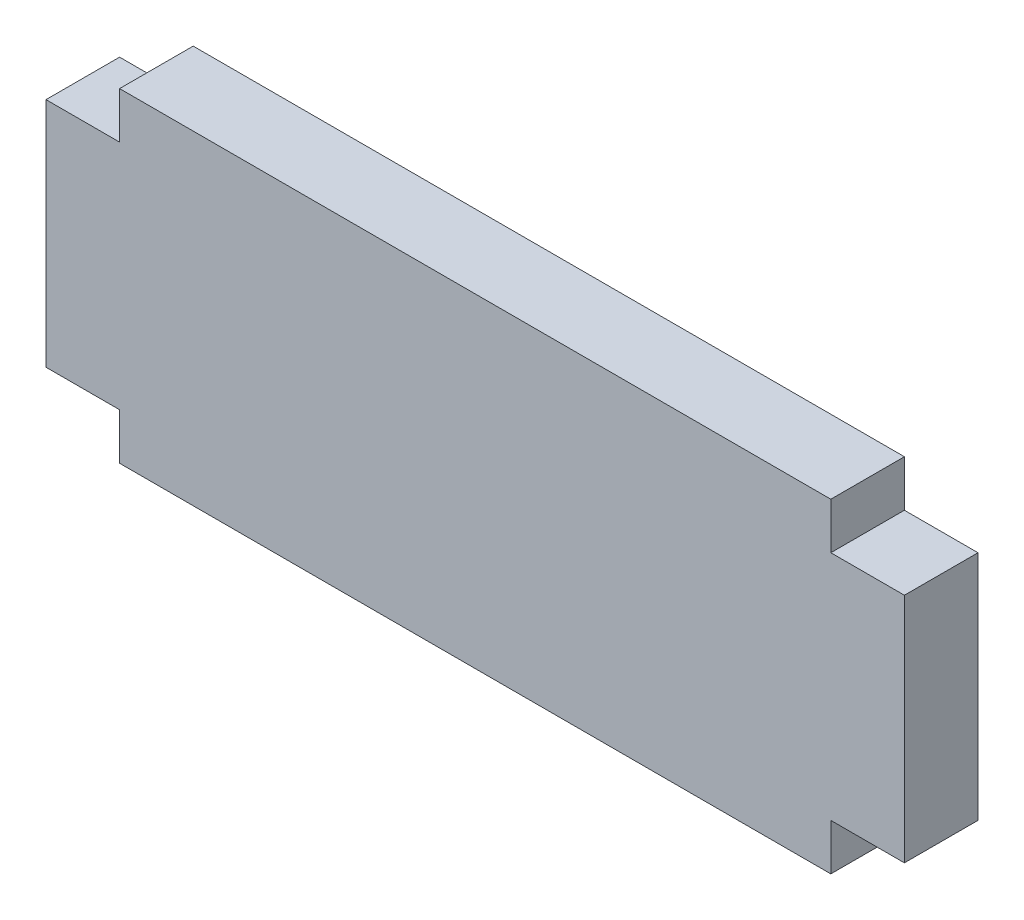
ISO-10303-21;
HEADER;
FILE_DESCRIPTION(('STEP AP214'),'2;1');
FILE_NAME('part.step','',(''),(''),'','','');
FILE_SCHEMA(('AUTOMOTIVE_DESIGN { 1 0 10303 214 1 1 1 1 }'));
ENDSEC;
DATA;
#1=APPLICATION_CONTEXT('core data for automotive mechanical design processes');
#2=APPLICATION_PROTOCOL_DEFINITION('international standard','automotive_design',2000,#1);
#3=PRODUCT_CONTEXT('',#1,'mechanical');
#4=PRODUCT('Part','Part','',(#3));
#5=PRODUCT_RELATED_PRODUCT_CATEGORY('part','',(#4));
#6=PRODUCT_DEFINITION_FORMATION('','',#4);
#7=PRODUCT_DEFINITION_CONTEXT('part definition',#1,'design');
#8=PRODUCT_DEFINITION('design','',#6,#7);
#9=PRODUCT_DEFINITION_SHAPE('','',#8);
#10=(LENGTH_UNIT() NAMED_UNIT(*) SI_UNIT(.MILLI.,.METRE.));
#11=(NAMED_UNIT(*) PLANE_ANGLE_UNIT() SI_UNIT($,.RADIAN.));
#12=(NAMED_UNIT(*) SI_UNIT($,.STERADIAN.) SOLID_ANGLE_UNIT());
#13=UNCERTAINTY_MEASURE_WITH_UNIT(LENGTH_MEASURE(1.E-05),#10,'distance_accuracy_value','');
#14=(GEOMETRIC_REPRESENTATION_CONTEXT(3) GLOBAL_UNCERTAINTY_ASSIGNED_CONTEXT((#13)) GLOBAL_UNIT_ASSIGNED_CONTEXT((#10,
#11,#12)) REPRESENTATION_CONTEXT('',''));
#15=CARTESIAN_POINT('',(0.,0.,0.));
#16=DIRECTION('',(0.,0.,1.));
#17=DIRECTION('',(1.,0.,0.));
#18=AXIS2_PLACEMENT_3D('',#15,#16,#17);
#19=CARTESIAN_POINT('',(0.,5.,3.175));
#20=DIRECTION('',(0.,-1.,0.));
#21=DIRECTION('',(1.,0.,0.));
#22=AXIS2_PLACEMENT_3D('',#19,#20,#21);
#23=PLANE('',#22);
#24=DIRECTION('',(-1.,0.,0.));
#25=VECTOR('',#24,1.);
#26=CARTESIAN_POINT('',(0.,5.,0.));
#27=LINE('',#26,#25);
#28=CARTESIAN_POINT('',(-15.3423,5.,0.));
#29=VERTEX_POINT('',#28);
#30=CARTESIAN_POINT('',(-18.5173,5.,0.));
#31=VERTEX_POINT('',#30);
#32=EDGE_CURVE('E163',#29,#31,#27,.T.);
#33=ORIENTED_EDGE('',*,*,#32,.T.);
#34=DIRECTION('',(0.,0.,-1.));
#35=VECTOR('',#34,1.);
#36=CARTESIAN_POINT('',(-18.5173,5.,3.175));
#37=LINE('',#36,#35);
#38=CARTESIAN_POINT('',(-18.5173,5.,3.175));
#39=VERTEX_POINT('',#38);
#40=EDGE_CURVE('E11',#39,#31,#37,.T.);
#41=ORIENTED_EDGE('',*,*,#40,.F.);
#42=DIRECTION('',(-1.,0.,0.));
#43=VECTOR('',#42,1.);
#44=CARTESIAN_POINT('',(0.,5.,3.175));
#45=LINE('',#44,#43);
#46=CARTESIAN_POINT('',(-15.3423,5.,3.175));
#47=VERTEX_POINT('',#46);
#48=EDGE_CURVE('E226',#47,#39,#45,.T.);
#49=ORIENTED_EDGE('',*,*,#48,.F.);
#50=DIRECTION('',(0.,0.,-1.));
#51=VECTOR('',#50,1.);
#52=CARTESIAN_POINT('',(-15.3423,5.,3.175));
#53=LINE('',#52,#51);
#54=EDGE_CURVE('E55',#47,#29,#53,.T.);
#55=ORIENTED_EDGE('',*,*,#54,.T.);
#56=EDGE_LOOP('',(#33,#41,#49,#55));
#57=FACE_BOUND('',#56,.T.);
#58=ADVANCED_FACE('F39',(#57),#23,.F.);
#59=CARTESIAN_POINT('',(-18.5173,0.,3.175));
#60=DIRECTION('',(1.,0.,0.));
#61=DIRECTION('',(0.,1.,0.));
#62=AXIS2_PLACEMENT_3D('',#59,#60,#61);
#63=PLANE('',#62);
#64=DIRECTION('',(0.,-1.,0.));
#65=VECTOR('',#64,1.);
#66=CARTESIAN_POINT('',(-18.5173,0.,0.));
#67=LINE('',#66,#65);
#68=CARTESIAN_POINT('',(-18.5173,-5.,0.));
#69=VERTEX_POINT('',#68);
#70=EDGE_CURVE('E165',#31,#69,#67,.T.);
#71=ORIENTED_EDGE('',*,*,#70,.T.);
#72=DIRECTION('',(0.,0.,-1.));
#73=VECTOR('',#72,1.);
#74=CARTESIAN_POINT('',(-18.5173,-5.,3.175));
#75=LINE('',#74,#73);
#76=CARTESIAN_POINT('',(-18.5173,-5.,3.175));
#77=VERTEX_POINT('',#76);
#78=EDGE_CURVE('E47',#77,#69,#75,.T.);
#79=ORIENTED_EDGE('',*,*,#78,.F.);
#80=DIRECTION('',(0.,-1.,0.));
#81=VECTOR('',#80,1.);
#82=CARTESIAN_POINT('',(-18.5173,0.,3.175));
#83=LINE('',#82,#81);
#84=EDGE_CURVE('E105',#39,#77,#83,.T.);
#85=ORIENTED_EDGE('',*,*,#84,.F.);
#86=ORIENTED_EDGE('',*,*,#40,.T.);
#87=EDGE_LOOP('',(#71,#79,#85,#86));
#88=FACE_BOUND('',#87,.T.);
#89=ADVANCED_FACE('F212',(#88),#63,.F.);
#90=CARTESIAN_POINT('',(0.,-5.,3.175));
#91=DIRECTION('',(0.,-1.,0.));
#92=DIRECTION('',(1.,0.,0.));
#93=AXIS2_PLACEMENT_3D('',#90,#91,#92);
#94=PLANE('',#93);
#95=DIRECTION('',(-1.,0.,0.));
#96=VECTOR('',#95,1.);
#97=CARTESIAN_POINT('',(0.,-5.,0.));
#98=LINE('',#97,#96);
#99=CARTESIAN_POINT('',(-15.3423,-5.,0.));
#100=VERTEX_POINT('',#99);
#101=EDGE_CURVE('E168',#100,#69,#98,.T.);
#102=ORIENTED_EDGE('',*,*,#101,.F.);
#103=DIRECTION('',(0.,0.,-1.));
#104=VECTOR('',#103,1.);
#105=CARTESIAN_POINT('',(-15.3423,-5.,3.175));
#106=LINE('',#105,#104);
#107=CARTESIAN_POINT('',(-15.3423,-5.,3.175));
#108=VERTEX_POINT('',#107);
#109=EDGE_CURVE('E205',#108,#100,#106,.T.);
#110=ORIENTED_EDGE('',*,*,#109,.F.);
#111=DIRECTION('',(-1.,0.,0.));
#112=VECTOR('',#111,1.);
#113=CARTESIAN_POINT('',(0.,-5.,3.175));
#114=LINE('',#113,#112);
#115=EDGE_CURVE('E211',#108,#77,#114,.T.);
#116=ORIENTED_EDGE('',*,*,#115,.T.);
#117=ORIENTED_EDGE('',*,*,#78,.T.);
#118=EDGE_LOOP('',(#102,#110,#116,#117));
#119=FACE_BOUND('',#118,.T.);
#120=ADVANCED_FACE('F209',(#119),#94,.T.);
#121=CARTESIAN_POINT('',(-15.3423,0.,3.175));
#122=DIRECTION('',(-1.,0.,0.));
#123=DIRECTION('',(0.,0.,1.));
#124=AXIS2_PLACEMENT_3D('',#121,#122,#123);
#125=PLANE('',#124);
#126=DIRECTION('',(0.,1.,0.));
#127=VECTOR('',#126,1.);
#128=CARTESIAN_POINT('',(-15.3423,0.,0.));
#129=LINE('',#128,#127);
#130=CARTESIAN_POINT('',(-15.3423,-7.,0.));
#131=VERTEX_POINT('',#130);
#132=EDGE_CURVE('E171',#131,#100,#129,.T.);
#133=ORIENTED_EDGE('',*,*,#132,.F.);
#134=DIRECTION('',(0.,0.,-1.));
#135=VECTOR('',#134,1.);
#136=CARTESIAN_POINT('',(-15.3423,-7.,3.175));
#137=LINE('',#136,#135);
#138=CARTESIAN_POINT('',(-15.3423,-7.,3.175));
#139=VERTEX_POINT('',#138);
#140=EDGE_CURVE('E203',#139,#131,#137,.T.);
#141=ORIENTED_EDGE('',*,*,#140,.F.);
#142=DIRECTION('',(0.,1.,0.));
#143=VECTOR('',#142,1.);
#144=CARTESIAN_POINT('',(-15.3423,0.,3.175));
#145=LINE('',#144,#143);
#146=EDGE_CURVE('E159',#139,#108,#145,.T.);
#147=ORIENTED_EDGE('',*,*,#146,.T.);
#148=ORIENTED_EDGE('',*,*,#109,.T.);
#149=EDGE_LOOP('',(#133,#141,#147,#148));
#150=FACE_BOUND('',#149,.T.);
#151=ADVANCED_FACE('F220',(#150),#125,.T.);
#152=CARTESIAN_POINT('',(0.,-7.,3.175));
#153=DIRECTION('',(0.,1.,0.));
#154=DIRECTION('',(0.,0.,1.));
#155=AXIS2_PLACEMENT_3D('',#152,#153,#154);
#156=PLANE('',#155);
#157=DIRECTION('',(1.,0.,0.));
#158=VECTOR('',#157,1.);
#159=CARTESIAN_POINT('',(0.,-7.,0.));
#160=LINE('',#159,#158);
#161=CARTESIAN_POINT('',(15.3423,-7.,0.));
#162=VERTEX_POINT('',#161);
#163=EDGE_CURVE('E174',#131,#162,#160,.T.);
#164=ORIENTED_EDGE('',*,*,#163,.T.);
#165=DIRECTION('',(0.,0.,-1.));
#166=VECTOR('',#165,1.);
#167=CARTESIAN_POINT('',(15.3423,-7.,3.175));
#168=LINE('',#167,#166);
#169=CARTESIAN_POINT('',(15.3423,-7.,3.175));
#170=VERTEX_POINT('',#169);
#171=EDGE_CURVE('E200',#170,#162,#168,.T.);
#172=ORIENTED_EDGE('',*,*,#171,.F.);
#173=DIRECTION('',(1.,0.,0.));
#174=VECTOR('',#173,1.);
#175=CARTESIAN_POINT('',(0.,-7.,3.175));
#176=LINE('',#175,#174);
#177=EDGE_CURVE('E225',#139,#170,#176,.T.);
#178=ORIENTED_EDGE('',*,*,#177,.F.);
#179=ORIENTED_EDGE('',*,*,#140,.T.);
#180=EDGE_LOOP('',(#164,#172,#178,#179));
#181=FACE_BOUND('',#180,.T.);
#182=ADVANCED_FACE('F249',(#181),#156,.F.);
#183=CARTESIAN_POINT('',(15.3423,0.,3.175));
#184=DIRECTION('',(-1.,0.,0.));
#185=DIRECTION('',(0.,0.,1.));
#186=AXIS2_PLACEMENT_3D('',#183,#184,#185);
#187=PLANE('',#186);
#188=DIRECTION('',(0.,1.,0.));
#189=VECTOR('',#188,1.);
#190=CARTESIAN_POINT('',(15.3423,0.,0.));
#191=LINE('',#190,#189);
#192=CARTESIAN_POINT('',(15.3423,-5.,0.));
#193=VERTEX_POINT('',#192);
#194=EDGE_CURVE('E177',#162,#193,#191,.T.);
#195=ORIENTED_EDGE('',*,*,#194,.T.);
#196=DIRECTION('',(0.,0.,-1.));
#197=VECTOR('',#196,1.);
#198=CARTESIAN_POINT('',(15.3423,-5.,3.175));
#199=LINE('',#198,#197);
#200=CARTESIAN_POINT('',(15.3423,-5.,3.175));
#201=VERTEX_POINT('',#200);
#202=EDGE_CURVE('E197',#201,#193,#199,.T.);
#203=ORIENTED_EDGE('',*,*,#202,.F.);
#204=DIRECTION('',(0.,1.,0.));
#205=VECTOR('',#204,1.);
#206=CARTESIAN_POINT('',(15.3423,0.,3.175));
#207=LINE('',#206,#205);
#208=EDGE_CURVE('E145',#170,#201,#207,.T.);
#209=ORIENTED_EDGE('',*,*,#208,.F.);
#210=ORIENTED_EDGE('',*,*,#171,.T.);
#211=EDGE_LOOP('',(#195,#203,#209,#210));
#212=FACE_BOUND('',#211,.T.);
#213=ADVANCED_FACE('F252',(#212),#187,.F.);
#214=CARTESIAN_POINT('',(0.,-5.,3.175));
#215=DIRECTION('',(0.,1.,0.));
#216=DIRECTION('',(0.,0.,1.));
#217=AXIS2_PLACEMENT_3D('',#214,#215,#216);
#218=PLANE('',#217);
#219=DIRECTION('',(1.,0.,0.));
#220=VECTOR('',#219,1.);
#221=CARTESIAN_POINT('',(0.,-5.,0.));
#222=LINE('',#221,#220);
#223=CARTESIAN_POINT('',(18.5173,-5.,0.));
#224=VERTEX_POINT('',#223);
#225=EDGE_CURVE('E179',#193,#224,#222,.T.);
#226=ORIENTED_EDGE('',*,*,#225,.T.);
#227=DIRECTION('',(0.,0.,-1.));
#228=VECTOR('',#227,1.);
#229=CARTESIAN_POINT('',(18.5173,-5.,3.175));
#230=LINE('',#229,#228);
#231=CARTESIAN_POINT('',(18.5173,-5.,3.175));
#232=VERTEX_POINT('',#231);
#233=EDGE_CURVE('E195',#232,#224,#230,.T.);
#234=ORIENTED_EDGE('',*,*,#233,.F.);
#235=DIRECTION('',(1.,0.,0.));
#236=VECTOR('',#235,1.);
#237=CARTESIAN_POINT('',(0.,-5.,3.175));
#238=LINE('',#237,#236);
#239=EDGE_CURVE('E231',#201,#232,#238,.T.);
#240=ORIENTED_EDGE('',*,*,#239,.F.);
#241=ORIENTED_EDGE('',*,*,#202,.T.);
#242=EDGE_LOOP('',(#226,#234,#240,#241));
#243=FACE_BOUND('',#242,.T.);
#244=ADVANCED_FACE('F254',(#243),#218,.F.);
#245=CARTESIAN_POINT('',(18.5173,0.,3.175));
#246=DIRECTION('',(1.,0.,0.));
#247=DIRECTION('',(0.,0.,-1.));
#248=AXIS2_PLACEMENT_3D('',#245,#246,#247);
#249=PLANE('',#248);
#250=DIRECTION('',(0.,-1.,0.));
#251=VECTOR('',#250,1.);
#252=CARTESIAN_POINT('',(18.5173,0.,0.));
#253=LINE('',#252,#251);
#254=CARTESIAN_POINT('',(18.5173,5.,0.));
#255=VERTEX_POINT('',#254);
#256=EDGE_CURVE('E182',#255,#224,#253,.T.);
#257=ORIENTED_EDGE('',*,*,#256,.F.);
#258=DIRECTION('',(0.,0.,-1.));
#259=VECTOR('',#258,1.);
#260=CARTESIAN_POINT('',(18.5173,5.,3.175));
#261=LINE('',#260,#259);
#262=CARTESIAN_POINT('',(18.5173,5.,3.175));
#263=VERTEX_POINT('',#262);
#264=EDGE_CURVE('E193',#263,#255,#261,.T.);
#265=ORIENTED_EDGE('',*,*,#264,.F.);
#266=DIRECTION('',(0.,-1.,0.));
#267=VECTOR('',#266,1.);
#268=CARTESIAN_POINT('',(18.5173,0.,3.175));
#269=LINE('',#268,#267);
#270=EDGE_CURVE('E232',#263,#232,#269,.T.);
#271=ORIENTED_EDGE('',*,*,#270,.T.);
#272=ORIENTED_EDGE('',*,*,#233,.T.);
#273=EDGE_LOOP('',(#257,#265,#271,#272));
#274=FACE_BOUND('',#273,.T.);
#275=ADVANCED_FACE('F257',(#274),#249,.T.);
#276=CARTESIAN_POINT('',(0.,5.,3.175));
#277=DIRECTION('',(0.,1.,0.));
#278=DIRECTION('',(-1.,0.,0.));
#279=AXIS2_PLACEMENT_3D('',#276,#277,#278);
#280=PLANE('',#279);
#281=DIRECTION('',(1.,0.,0.));
#282=VECTOR('',#281,1.);
#283=CARTESIAN_POINT('',(0.,5.,0.));
#284=LINE('',#283,#282);
#285=CARTESIAN_POINT('',(15.3423,5.,0.));
#286=VERTEX_POINT('',#285);
#287=EDGE_CURVE('E185',#286,#255,#284,.T.);
#288=ORIENTED_EDGE('',*,*,#287,.F.);
#289=DIRECTION('',(0.,0.,-1.));
#290=VECTOR('',#289,1.);
#291=CARTESIAN_POINT('',(15.3423,5.,3.175));
#292=LINE('',#291,#290);
#293=CARTESIAN_POINT('',(15.3423,5.,3.175));
#294=VERTEX_POINT('',#293);
#295=EDGE_CURVE('E153',#294,#286,#292,.T.);
#296=ORIENTED_EDGE('',*,*,#295,.F.);
#297=DIRECTION('',(1.,0.,0.));
#298=VECTOR('',#297,1.);
#299=CARTESIAN_POINT('',(0.,5.,3.175));
#300=LINE('',#299,#298);
#301=EDGE_CURVE('E142',#294,#263,#300,.T.);
#302=ORIENTED_EDGE('',*,*,#301,.T.);
#303=ORIENTED_EDGE('',*,*,#264,.T.);
#304=EDGE_LOOP('',(#288,#296,#302,#303));
#305=FACE_BOUND('',#304,.T.);
#306=ADVANCED_FACE('F237',(#305),#280,.T.);
#307=CARTESIAN_POINT('',(15.3423,7.,0.));
#308=VERTEX_POINT('',#307);
#309=EDGE_CURVE('E150',#286,#308,#191,.T.);
#310=ORIENTED_EDGE('',*,*,#309,.T.);
#311=DIRECTION('',(0.,0.,-1.));
#312=VECTOR('',#311,1.);
#313=CARTESIAN_POINT('',(15.3423,7.,3.175));
#314=LINE('',#313,#312);
#315=CARTESIAN_POINT('',(15.3423,7.,3.175));
#316=VERTEX_POINT('',#315);
#317=EDGE_CURVE('E147',#316,#308,#314,.T.);
#318=ORIENTED_EDGE('',*,*,#317,.F.);
#319=EDGE_CURVE('E134',#294,#316,#207,.T.);
#320=ORIENTED_EDGE('',*,*,#319,.F.);
#321=ORIENTED_EDGE('',*,*,#295,.T.);
#322=EDGE_LOOP('',(#310,#318,#320,#321));
#323=FACE_BOUND('',#322,.T.);
#324=ADVANCED_FACE('F148',(#323),#187,.F.);
#325=CARTESIAN_POINT('',(0.,7.,3.175));
#326=DIRECTION('',(0.,1.,0.));
#327=DIRECTION('',(0.,0.,1.));
#328=AXIS2_PLACEMENT_3D('',#325,#326,#327);
#329=PLANE('',#328);
#330=DIRECTION('',(1.,0.,0.));
#331=VECTOR('',#330,1.);
#332=CARTESIAN_POINT('',(0.,7.,0.));
#333=LINE('',#332,#331);
#334=CARTESIAN_POINT('',(-15.3423,7.,0.));
#335=VERTEX_POINT('',#334);
#336=EDGE_CURVE('E188',#335,#308,#333,.T.);
#337=ORIENTED_EDGE('',*,*,#336,.F.);
#338=DIRECTION('',(0.,0.,-1.));
#339=VECTOR('',#338,1.);
#340=CARTESIAN_POINT('',(-15.3423,7.,3.175));
#341=LINE('',#340,#339);
#342=CARTESIAN_POINT('',(-15.3423,7.,3.175));
#343=VERTEX_POINT('',#342);
#344=EDGE_CURVE('E93',#343,#335,#341,.T.);
#345=ORIENTED_EDGE('',*,*,#344,.F.);
#346=DIRECTION('',(1.,0.,0.));
#347=VECTOR('',#346,1.);
#348=CARTESIAN_POINT('',(0.,7.,3.175));
#349=LINE('',#348,#347);
#350=EDGE_CURVE('E139',#343,#316,#349,.T.);
#351=ORIENTED_EDGE('',*,*,#350,.T.);
#352=ORIENTED_EDGE('',*,*,#317,.T.);
#353=EDGE_LOOP('',(#337,#345,#351,#352));
#354=FACE_BOUND('',#353,.T.);
#355=ADVANCED_FACE('F155',(#354),#329,.T.);
#356=EDGE_CURVE('E175',#29,#335,#129,.T.);
#357=ORIENTED_EDGE('',*,*,#356,.F.);
#358=ORIENTED_EDGE('',*,*,#54,.F.);
#359=EDGE_CURVE('E156',#47,#343,#145,.T.);
#360=ORIENTED_EDGE('',*,*,#359,.T.);
#361=ORIENTED_EDGE('',*,*,#344,.T.);
#362=EDGE_LOOP('',(#357,#358,#360,#361));
#363=FACE_BOUND('',#362,.T.);
#364=ADVANCED_FACE('F267',(#363),#125,.T.);
#365=CARTESIAN_POINT('',(0.,0.,3.175));
#366=DIRECTION('',(0.,0.,1.));
#367=DIRECTION('',(1.,0.,0.));
#368=AXIS2_PLACEMENT_3D('',#365,#366,#367);
#369=PLANE('',#368);
#370=ORIENTED_EDGE('',*,*,#48,.T.);
#371=ORIENTED_EDGE('',*,*,#84,.T.);
#372=ORIENTED_EDGE('',*,*,#115,.F.);
#373=ORIENTED_EDGE('',*,*,#146,.F.);
#374=ORIENTED_EDGE('',*,*,#177,.T.);
#375=ORIENTED_EDGE('',*,*,#208,.T.);
#376=ORIENTED_EDGE('',*,*,#239,.T.);
#377=ORIENTED_EDGE('',*,*,#270,.F.);
#378=ORIENTED_EDGE('',*,*,#301,.F.);
#379=ORIENTED_EDGE('',*,*,#319,.T.);
#380=ORIENTED_EDGE('',*,*,#350,.F.);
#381=ORIENTED_EDGE('',*,*,#359,.F.);
#382=EDGE_LOOP('',(#370,#371,#372,#373,#374,#375,#376,#377,#378,#379,#380,#381));
#383=FACE_BOUND('',#382,.T.);
#384=ADVANCED_FACE('F136',(#383),#369,.T.);
#385=CARTESIAN_POINT('',(0.,0.,0.));
#386=DIRECTION('',(0.,0.,1.));
#387=DIRECTION('',(1.,0.,0.));
#388=AXIS2_PLACEMENT_3D('',#385,#386,#387);
#389=PLANE('',#388);
#390=ORIENTED_EDGE('',*,*,#32,.F.);
#391=ORIENTED_EDGE('',*,*,#356,.T.);
#392=ORIENTED_EDGE('',*,*,#336,.T.);
#393=ORIENTED_EDGE('',*,*,#309,.F.);
#394=ORIENTED_EDGE('',*,*,#287,.T.);
#395=ORIENTED_EDGE('',*,*,#256,.T.);
#396=ORIENTED_EDGE('',*,*,#225,.F.);
#397=ORIENTED_EDGE('',*,*,#194,.F.);
#398=ORIENTED_EDGE('',*,*,#163,.F.);
#399=ORIENTED_EDGE('',*,*,#132,.T.);
#400=ORIENTED_EDGE('',*,*,#101,.T.);
#401=ORIENTED_EDGE('',*,*,#70,.F.);
#402=EDGE_LOOP('',(#390,#391,#392,#393,#394,#395,#396,#397,#398,#399,#400,#401));
#403=FACE_BOUND('',#402,.T.);
#404=ADVANCED_FACE('F215',(#403),#389,.F.);
#405=CLOSED_SHELL('',(#58,#89,#120,#151,#182,#213,#244,#275,#306,#324,#355,#364,#384,#404));
#406=MANIFOLD_SOLID_BREP('B2',#405);
#407=ADVANCED_BREP_SHAPE_REPRESENTATION('',(#18,#406),#14);
#408=SHAPE_DEFINITION_REPRESENTATION(#9,#407);
ENDSEC;
END-ISO-10303-21;
